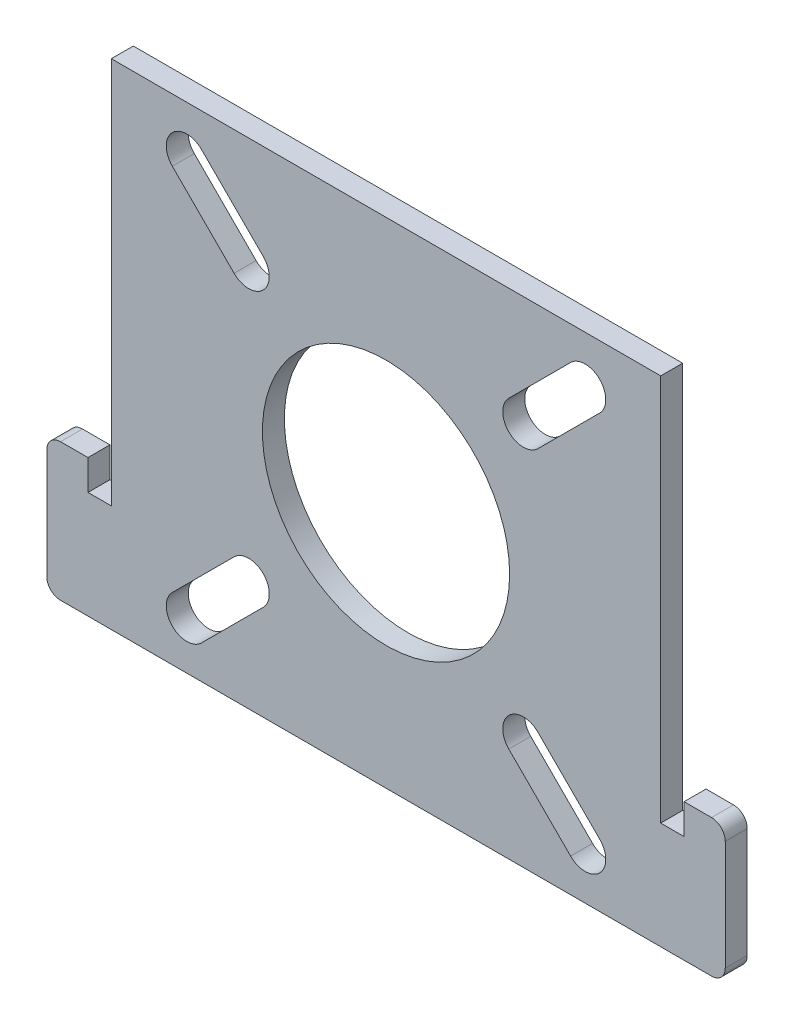
ISO-10303-21;
HEADER;
FILE_DESCRIPTION(('STEP AP214'),'2;1');
FILE_NAME('part.step','',(''),(''),'','','');
FILE_SCHEMA(('AUTOMOTIVE_DESIGN { 1 0 10303 214 1 1 1 1 }'));
ENDSEC;
DATA;
#1=APPLICATION_CONTEXT('core data for automotive mechanical design processes');
#2=APPLICATION_PROTOCOL_DEFINITION('international standard','automotive_design',2000,#1);
#3=PRODUCT_CONTEXT('',#1,'mechanical');
#4=PRODUCT('Part','Part','',(#3));
#5=PRODUCT_RELATED_PRODUCT_CATEGORY('part','',(#4));
#6=PRODUCT_DEFINITION_FORMATION('','',#4);
#7=PRODUCT_DEFINITION_CONTEXT('part definition',#1,'design');
#8=PRODUCT_DEFINITION('design','',#6,#7);
#9=PRODUCT_DEFINITION_SHAPE('','',#8);
#10=(LENGTH_UNIT() NAMED_UNIT(*) SI_UNIT(.MILLI.,.METRE.));
#11=(NAMED_UNIT(*) PLANE_ANGLE_UNIT() SI_UNIT($,.RADIAN.));
#12=(NAMED_UNIT(*) SI_UNIT($,.STERADIAN.) SOLID_ANGLE_UNIT());
#13=UNCERTAINTY_MEASURE_WITH_UNIT(LENGTH_MEASURE(1.E-05),#10,'distance_accuracy_value','');
#14=(GEOMETRIC_REPRESENTATION_CONTEXT(3) GLOBAL_UNCERTAINTY_ASSIGNED_CONTEXT((#13)) GLOBAL_UNIT_ASSIGNED_CONTEXT((#10,
#11,#12)) REPRESENTATION_CONTEXT('',''));
#15=CARTESIAN_POINT('',(0.,0.,0.));
#16=DIRECTION('',(0.,0.,1.));
#17=DIRECTION('',(1.,0.,0.));
#18=AXIS2_PLACEMENT_3D('',#15,#16,#17);
#19=CARTESIAN_POINT('',(-20.,18.,1.6));
#20=DIRECTION('',(1.,0.,0.));
#21=DIRECTION('',(0.,1.,0.));
#22=AXIS2_PLACEMENT_3D('',#19,#20,#21);
#23=PLANE('',#22);
#24=DIRECTION('',(0.,0.,-1.));
#25=VECTOR('',#24,1.);
#26=CARTESIAN_POINT('',(-20.,-10.2,12.6494343746637));
#27=LINE('',#26,#25);
#28=CARTESIAN_POINT('',(-20.,-10.2,1.6));
#29=VERTEX_POINT('',#28);
#30=CARTESIAN_POINT('',(-20.,-10.2,0.));
#31=VERTEX_POINT('',#30);
#32=EDGE_CURVE('E282',#29,#31,#27,.T.);
#33=ORIENTED_EDGE('',*,*,#32,.F.);
#34=DIRECTION('',(0.,-1.,0.));
#35=VECTOR('',#34,1.);
#36=CARTESIAN_POINT('',(-20.,18.,1.6));
#37=LINE('',#36,#35);
#38=CARTESIAN_POINT('',(-20.,18.,1.6));
#39=VERTEX_POINT('',#38);
#40=EDGE_CURVE('E287',#39,#29,#37,.T.);
#41=ORIENTED_EDGE('',*,*,#40,.F.);
#42=DIRECTION('',(0.,0.,-1.));
#43=VECTOR('',#42,1.);
#44=CARTESIAN_POINT('',(-20.,18.,1.6));
#45=LINE('',#44,#43);
#46=CARTESIAN_POINT('',(-20.,18.,0.));
#47=VERTEX_POINT('',#46);
#48=EDGE_CURVE('E344',#39,#47,#45,.T.);
#49=ORIENTED_EDGE('',*,*,#48,.T.);
#50=DIRECTION('',(0.,-1.,0.));
#51=VECTOR('',#50,1.);
#52=CARTESIAN_POINT('',(-20.,18.,0.));
#53=LINE('',#52,#51);
#54=EDGE_CURVE('E386',#47,#31,#53,.T.);
#55=ORIENTED_EDGE('',*,*,#54,.T.);
#56=EDGE_LOOP('',(#33,#41,#49,#55));
#57=FACE_BOUND('',#56,.T.);
#58=ADVANCED_FACE('F34',(#57),#23,.F.);
#59=CARTESIAN_POINT('',(0.,0.,1.6));
#60=DIRECTION('',(0.,0.,1.));
#61=DIRECTION('',(1.,0.,0.));
#62=AXIS2_PLACEMENT_3D('',#59,#60,#61);
#63=PLANE('',#62);
#64=DIRECTION('',(0.707106781186548,-0.707106781186547,0.));
#65=VECTOR('',#64,1.);
#66=CARTESIAN_POINT('',(8.93933982822018,-11.0606601717798,1.6));
#67=LINE('',#66,#65);
#68=CARTESIAN_POINT('',(8.93933982822018,-11.0606601717798,1.6));
#69=VERTEX_POINT('',#68);
#70=CARTESIAN_POINT('',(13.4393398282202,-15.5606601717798,1.6));
#71=VERTEX_POINT('',#70);
#72=EDGE_CURVE('E442',#69,#71,#67,.T.);
#73=ORIENTED_EDGE('',*,*,#72,.F.);
#74=CARTESIAN_POINT('',(10.,-10.,1.6));
#75=DIRECTION('',(0.,0.,1.));
#76=DIRECTION('',(1.,0.,0.));
#77=AXIS2_PLACEMENT_3D('',#74,#75,#76);
#78=CIRCLE('',#77,1.5);
#79=CARTESIAN_POINT('',(11.0606601717798,-8.93933982822018,1.6));
#80=VERTEX_POINT('',#79);
#81=EDGE_CURVE('E440',#80,#69,#78,.T.);
#82=ORIENTED_EDGE('',*,*,#81,.F.);
#83=DIRECTION('',(-0.707106781186549,0.707106781186546,0.));
#84=VECTOR('',#83,1.);
#85=CARTESIAN_POINT('',(11.0606601717798,-8.93933982822018,1.6));
#86=LINE('',#85,#84);
#87=CARTESIAN_POINT('',(15.5606601717798,-13.4393398282202,1.6));
#88=VERTEX_POINT('',#87);
#89=EDGE_CURVE('E448',#88,#80,#86,.T.);
#90=ORIENTED_EDGE('',*,*,#89,.F.);
#91=CARTESIAN_POINT('',(14.5,-14.5,1.6));
#92=DIRECTION('',(0.,0.,1.));
#93=DIRECTION('',(1.,0.,0.));
#94=AXIS2_PLACEMENT_3D('',#91,#92,#93);
#95=CIRCLE('',#94,1.5);
#96=EDGE_CURVE('E445',#71,#88,#95,.T.);
#97=ORIENTED_EDGE('',*,*,#96,.F.);
#98=EDGE_LOOP('',(#73,#82,#90,#97));
#99=FACE_BOUND('',#98,.T.);
#100=DIRECTION('',(0.707106781186548,-0.707106781186547,0.));
#101=VECTOR('',#100,1.);
#102=CARTESIAN_POINT('',(-15.5606601717798,13.4393398282202,1.6));
#103=LINE('',#102,#101);
#104=CARTESIAN_POINT('',(-15.5606601717798,13.4393398282202,1.6));
#105=VERTEX_POINT('',#104);
#106=CARTESIAN_POINT('',(-11.0606601717798,8.93933982822018,1.6));
#107=VERTEX_POINT('',#106);
#108=EDGE_CURVE('E504',#105,#107,#103,.T.);
#109=ORIENTED_EDGE('',*,*,#108,.F.);
#110=CARTESIAN_POINT('',(-14.5,14.5,1.6));
#111=DIRECTION('',(0.,0.,1.));
#112=DIRECTION('',(1.,0.,0.));
#113=AXIS2_PLACEMENT_3D('',#110,#111,#112);
#114=CIRCLE('',#113,1.5);
#115=CARTESIAN_POINT('',(-13.4393398282202,15.5606601717798,1.6));
#116=VERTEX_POINT('',#115);
#117=EDGE_CURVE('E502',#116,#105,#114,.T.);
#118=ORIENTED_EDGE('',*,*,#117,.F.);
#119=DIRECTION('',(-0.707106781186547,0.707106781186548,0.));
#120=VECTOR('',#119,1.);
#121=CARTESIAN_POINT('',(-13.4393398282202,15.5606601717798,1.6));
#122=LINE('',#121,#120);
#123=CARTESIAN_POINT('',(-8.93933982822018,11.0606601717798,1.6));
#124=VERTEX_POINT('',#123);
#125=EDGE_CURVE('E510',#124,#116,#122,.T.);
#126=ORIENTED_EDGE('',*,*,#125,.F.);
#127=CARTESIAN_POINT('',(-10.,10.,1.6));
#128=DIRECTION('',(0.,0.,1.));
#129=DIRECTION('',(1.,0.,0.));
#130=AXIS2_PLACEMENT_3D('',#127,#128,#129);
#131=CIRCLE('',#130,1.5);
#132=EDGE_CURVE('E507',#107,#124,#131,.T.);
#133=ORIENTED_EDGE('',*,*,#132,.F.);
#134=EDGE_LOOP('',(#109,#118,#126,#133));
#135=FACE_BOUND('',#134,.T.);
#136=DIRECTION('',(0.,1.,0.));
#137=VECTOR('',#136,1.);
#138=CARTESIAN_POINT('',(24.7,-18.,1.6));
#139=LINE('',#138,#137);
#140=CARTESIAN_POINT('',(24.7,-17.,1.6));
#141=VERTEX_POINT('',#140);
#142=CARTESIAN_POINT('',(24.7,-9.,1.6));
#143=VERTEX_POINT('',#142);
#144=EDGE_CURVE('E397',#141,#143,#139,.T.);
#145=ORIENTED_EDGE('',*,*,#144,.T.);
#146=CARTESIAN_POINT('',(23.7,-9.,1.6));
#147=DIRECTION('',(0.,0.,1.));
#148=DIRECTION('',(1.,0.,0.));
#149=AXIS2_PLACEMENT_3D('',#146,#147,#148);
#150=CIRCLE('',#149,1.);
#151=CARTESIAN_POINT('',(23.7,-8.,1.6));
#152=VERTEX_POINT('',#151);
#153=EDGE_CURVE('E318',#143,#152,#150,.T.);
#154=ORIENTED_EDGE('',*,*,#153,.T.);
#155=DIRECTION('',(-1.,0.,0.));
#156=VECTOR('',#155,1.);
#157=CARTESIAN_POINT('',(24.7,-8.,1.6));
#158=LINE('',#157,#156);
#159=CARTESIAN_POINT('',(21.7,-8.,1.6));
#160=VERTEX_POINT('',#159);
#161=EDGE_CURVE('E932',#152,#160,#158,.T.);
#162=ORIENTED_EDGE('',*,*,#161,.T.);
#163=DIRECTION('',(0.,-1.,0.));
#164=VECTOR('',#163,1.);
#165=CARTESIAN_POINT('',(21.7,-8.,1.6));
#166=LINE('',#165,#164);
#167=CARTESIAN_POINT('',(21.7,-10.2,1.6));
#168=VERTEX_POINT('',#167);
#169=EDGE_CURVE('E422',#160,#168,#166,.T.);
#170=ORIENTED_EDGE('',*,*,#169,.T.);
#171=DIRECTION('',(-1.,0.,0.));
#172=VECTOR('',#171,1.);
#173=CARTESIAN_POINT('',(21.7,-10.2,1.6));
#174=LINE('',#173,#172);
#175=CARTESIAN_POINT('',(20.,-10.2,1.6));
#176=VERTEX_POINT('',#175);
#177=EDGE_CURVE('E395',#168,#176,#174,.T.);
#178=ORIENTED_EDGE('',*,*,#177,.T.);
#179=DIRECTION('',(0.,1.,0.));
#180=VECTOR('',#179,1.);
#181=CARTESIAN_POINT('',(20.,18.,1.6));
#182=LINE('',#181,#180);
#183=CARTESIAN_POINT('',(20.,18.,1.6));
#184=VERTEX_POINT('',#183);
#185=EDGE_CURVE('E362',#176,#184,#182,.T.);
#186=ORIENTED_EDGE('',*,*,#185,.T.);
#187=DIRECTION('',(-1.,0.,0.));
#188=VECTOR('',#187,1.);
#189=CARTESIAN_POINT('',(-20.,18.,1.6));
#190=LINE('',#189,#188);
#191=EDGE_CURVE('E349',#184,#39,#190,.T.);
#192=ORIENTED_EDGE('',*,*,#191,.T.);
#193=ORIENTED_EDGE('',*,*,#40,.T.);
#194=DIRECTION('',(1.,0.,0.));
#195=VECTOR('',#194,1.);
#196=CARTESIAN_POINT('',(-21.7,-10.2,1.6));
#197=LINE('',#196,#195);
#198=CARTESIAN_POINT('',(-21.7,-10.2,1.6));
#199=VERTEX_POINT('',#198);
#200=EDGE_CURVE('E286',#199,#29,#197,.T.);
#201=ORIENTED_EDGE('',*,*,#200,.F.);
#202=DIRECTION('',(0.,-1.,0.));
#203=VECTOR('',#202,1.);
#204=CARTESIAN_POINT('',(-21.7,-8.,1.6));
#205=LINE('',#204,#203);
#206=CARTESIAN_POINT('',(-21.7,-8.,1.6));
#207=VERTEX_POINT('',#206);
#208=EDGE_CURVE('E264',#207,#199,#205,.T.);
#209=ORIENTED_EDGE('',*,*,#208,.F.);
#210=DIRECTION('',(1.,0.,0.));
#211=VECTOR('',#210,1.);
#212=CARTESIAN_POINT('',(-24.7,-8.,1.6));
#213=LINE('',#212,#211);
#214=CARTESIAN_POINT('',(-23.7,-8.,1.6));
#215=VERTEX_POINT('',#214);
#216=EDGE_CURVE('E260',#215,#207,#213,.T.);
#217=ORIENTED_EDGE('',*,*,#216,.F.);
#218=CARTESIAN_POINT('',(-23.7,-9.,1.6));
#219=DIRECTION('',(0.,0.,1.));
#220=DIRECTION('',(1.,0.,0.));
#221=AXIS2_PLACEMENT_3D('',#218,#219,#220);
#222=CIRCLE('',#221,1.);
#223=CARTESIAN_POINT('',(-24.7,-9.,1.6));
#224=VERTEX_POINT('',#223);
#225=EDGE_CURVE('E49',#215,#224,#222,.T.);
#226=ORIENTED_EDGE('',*,*,#225,.T.);
#227=DIRECTION('',(0.,1.,0.));
#228=VECTOR('',#227,1.);
#229=CARTESIAN_POINT('',(-24.7,-18.,1.6));
#230=LINE('',#229,#228);
#231=CARTESIAN_POINT('',(-24.7,-17.,1.6));
#232=VERTEX_POINT('',#231);
#233=EDGE_CURVE('E272',#232,#224,#230,.T.);
#234=ORIENTED_EDGE('',*,*,#233,.F.);
#235=CARTESIAN_POINT('',(-23.7,-17.,1.6));
#236=DIRECTION('',(0.,0.,1.));
#237=DIRECTION('',(1.,0.,0.));
#238=AXIS2_PLACEMENT_3D('',#235,#236,#237);
#239=CIRCLE('',#238,1.);
#240=CARTESIAN_POINT('',(-23.7,-18.,1.6));
#241=VERTEX_POINT('',#240);
#242=EDGE_CURVE('E314',#232,#241,#239,.T.);
#243=ORIENTED_EDGE('',*,*,#242,.T.);
#244=DIRECTION('',(1.,0.,0.));
#245=VECTOR('',#244,1.);
#246=CARTESIAN_POINT('',(-20.,-18.,1.6));
#247=LINE('',#246,#245);
#248=CARTESIAN_POINT('',(23.7,-18.,1.6));
#249=VERTEX_POINT('',#248);
#250=EDGE_CURVE('E342',#241,#249,#247,.T.);
#251=ORIENTED_EDGE('',*,*,#250,.T.);
#252=CARTESIAN_POINT('',(23.7,-17.,1.6));
#253=DIRECTION('',(0.,0.,1.));
#254=DIRECTION('',(1.,0.,0.));
#255=AXIS2_PLACEMENT_3D('',#252,#253,#254);
#256=CIRCLE('',#255,1.);
#257=EDGE_CURVE('E316',#249,#141,#256,.T.);
#258=ORIENTED_EDGE('',*,*,#257,.T.);
#259=EDGE_LOOP('',(#145,#154,#162,#170,#178,#186,#192,#193,#201,#209,#217,#226,#234,#243,#251,#258));
#260=FACE_BOUND('',#259,.T.);
#261=CARTESIAN_POINT('',(0.,0.,1.6));
#262=DIRECTION('',(0.,0.,1.));
#263=DIRECTION('',(1.,0.,0.));
#264=AXIS2_PLACEMENT_3D('',#261,#262,#263);
#265=CIRCLE('',#264,9.);
#266=CARTESIAN_POINT('',(9.,0.,1.6));
#267=VERTEX_POINT('',#266);
#268=EDGE_CURVE('E361',#267,#267,#265,.T.);
#269=ORIENTED_EDGE('',*,*,#268,.F.);
#270=EDGE_LOOP('',(#269));
#271=FACE_BOUND('',#270,.T.);
#272=DIRECTION('',(0.707106781186548,0.707106781186547,0.));
#273=VECTOR('',#272,1.);
#274=CARTESIAN_POINT('',(11.0606601717798,8.93933982822018,1.6));
#275=LINE('',#274,#273);
#276=CARTESIAN_POINT('',(11.0606601717798,8.93933982822018,1.6));
#277=VERTEX_POINT('',#276);
#278=CARTESIAN_POINT('',(15.5606601717798,13.4393398282202,1.6));
#279=VERTEX_POINT('',#278);
#280=EDGE_CURVE('E473',#277,#279,#275,.T.);
#281=ORIENTED_EDGE('',*,*,#280,.F.);
#282=CARTESIAN_POINT('',(9.99999999999999,10.,1.6));
#283=DIRECTION('',(0.,0.,1.));
#284=DIRECTION('',(1.,0.,0.));
#285=AXIS2_PLACEMENT_3D('',#282,#283,#284);
#286=CIRCLE('',#285,1.5);
#287=CARTESIAN_POINT('',(8.93933982822017,11.0606601717798,1.6));
#288=VERTEX_POINT('',#287);
#289=EDGE_CURVE('E471',#288,#277,#286,.T.);
#290=ORIENTED_EDGE('',*,*,#289,.F.);
#291=DIRECTION('',(-0.707106781186547,-0.707106781186548,0.));
#292=VECTOR('',#291,1.);
#293=CARTESIAN_POINT('',(8.93933982822017,11.0606601717798,1.6));
#294=LINE('',#293,#292);
#295=CARTESIAN_POINT('',(13.4393398282202,15.5606601717798,1.6));
#296=VERTEX_POINT('',#295);
#297=EDGE_CURVE('E479',#296,#288,#294,.T.);
#298=ORIENTED_EDGE('',*,*,#297,.F.);
#299=CARTESIAN_POINT('',(14.5,14.5,1.6));
#300=DIRECTION('',(0.,0.,1.));
#301=DIRECTION('',(1.,0.,0.));
#302=AXIS2_PLACEMENT_3D('',#299,#300,#301);
#303=CIRCLE('',#302,1.5);
#304=EDGE_CURVE('E476',#279,#296,#303,.T.);
#305=ORIENTED_EDGE('',*,*,#304,.F.);
#306=EDGE_LOOP('',(#281,#290,#298,#305));
#307=FACE_BOUND('',#306,.T.);
#308=DIRECTION('',(0.707106781186548,0.707106781186547,0.));
#309=VECTOR('',#308,1.);
#310=CARTESIAN_POINT('',(-13.4393398282202,-15.5606601717798,1.6));
#311=LINE('',#310,#309);
#312=CARTESIAN_POINT('',(-13.4393398282202,-15.5606601717798,1.6));
#313=VERTEX_POINT('',#312);
#314=CARTESIAN_POINT('',(-8.93933982822018,-11.0606601717798,1.6));
#315=VERTEX_POINT('',#314);
#316=EDGE_CURVE('E409',#313,#315,#311,.T.);
#317=ORIENTED_EDGE('',*,*,#316,.F.);
#318=CARTESIAN_POINT('',(-14.5,-14.5,1.6));
#319=DIRECTION('',(0.,0.,1.));
#320=DIRECTION('',(1.,0.,0.));
#321=AXIS2_PLACEMENT_3D('',#318,#319,#320);
#322=CIRCLE('',#321,1.5);
#323=CARTESIAN_POINT('',(-15.5606601717798,-13.4393398282202,1.6));
#324=VERTEX_POINT('',#323);
#325=EDGE_CURVE('E407',#324,#313,#322,.T.);
#326=ORIENTED_EDGE('',*,*,#325,.F.);
#327=DIRECTION('',(-0.707106781186547,-0.707106781186548,0.));
#328=VECTOR('',#327,1.);
#329=CARTESIAN_POINT('',(-15.5606601717798,-13.4393398282202,1.6));
#330=LINE('',#329,#328);
#331=CARTESIAN_POINT('',(-11.0606601717798,-8.93933982822018,1.6));
#332=VERTEX_POINT('',#331);
#333=EDGE_CURVE('E415',#332,#324,#330,.T.);
#334=ORIENTED_EDGE('',*,*,#333,.F.);
#335=CARTESIAN_POINT('',(-10.,-10.,1.6));
#336=DIRECTION('',(0.,0.,1.));
#337=DIRECTION('',(1.,0.,0.));
#338=AXIS2_PLACEMENT_3D('',#335,#336,#337);
#339=CIRCLE('',#338,1.5);
#340=EDGE_CURVE('E412',#315,#332,#339,.T.);
#341=ORIENTED_EDGE('',*,*,#340,.F.);
#342=EDGE_LOOP('',(#317,#326,#334,#341));
#343=FACE_BOUND('',#342,.T.);
#344=ADVANCED_FACE('F374',(#99,#135,#260,#271,#307,#343),#63,.T.);
#345=CARTESIAN_POINT('',(0.,0.,0.));
#346=DIRECTION('',(0.,0.,1.));
#347=DIRECTION('',(1.,0.,0.));
#348=AXIS2_PLACEMENT_3D('',#345,#346,#347);
#349=PLANE('',#348);
#350=CARTESIAN_POINT('',(10.,-10.,0.));
#351=DIRECTION('',(0.,0.,1.));
#352=DIRECTION('',(1.,0.,0.));
#353=AXIS2_PLACEMENT_3D('',#350,#351,#352);
#354=CIRCLE('',#353,1.5);
#355=CARTESIAN_POINT('',(11.0606601717798,-8.93933982822019,0.));
#356=VERTEX_POINT('',#355);
#357=CARTESIAN_POINT('',(8.93933982822018,-11.0606601717798,0.));
#358=VERTEX_POINT('',#357);
#359=EDGE_CURVE('E439',#356,#358,#354,.T.);
#360=ORIENTED_EDGE('',*,*,#359,.T.);
#361=DIRECTION('',(0.707106781186548,-0.707106781186547,0.));
#362=VECTOR('',#361,1.);
#363=CARTESIAN_POINT('',(8.93933982822018,-11.0606601717798,0.));
#364=LINE('',#363,#362);
#365=CARTESIAN_POINT('',(13.4393398282202,-15.5606601717798,0.));
#366=VERTEX_POINT('',#365);
#367=EDGE_CURVE('E453',#358,#366,#364,.T.);
#368=ORIENTED_EDGE('',*,*,#367,.T.);
#369=CARTESIAN_POINT('',(14.5,-14.5,0.));
#370=DIRECTION('',(0.,0.,1.));
#371=DIRECTION('',(1.,0.,0.));
#372=AXIS2_PLACEMENT_3D('',#369,#370,#371);
#373=CIRCLE('',#372,1.5);
#374=CARTESIAN_POINT('',(15.5606601717798,-13.4393398282202,0.));
#375=VERTEX_POINT('',#374);
#376=EDGE_CURVE('E456',#366,#375,#373,.T.);
#377=ORIENTED_EDGE('',*,*,#376,.T.);
#378=DIRECTION('',(-0.707106781186549,0.707106781186546,0.));
#379=VECTOR('',#378,1.);
#380=CARTESIAN_POINT('',(11.0606601717798,-8.93933982822018,0.));
#381=LINE('',#380,#379);
#382=EDGE_CURVE('E443',#375,#356,#381,.T.);
#383=ORIENTED_EDGE('',*,*,#382,.T.);
#384=EDGE_LOOP('',(#360,#368,#377,#383));
#385=FACE_BOUND('',#384,.T.);
#386=CARTESIAN_POINT('',(-14.5,14.5,0.));
#387=DIRECTION('',(0.,0.,1.));
#388=DIRECTION('',(1.,0.,0.));
#389=AXIS2_PLACEMENT_3D('',#386,#387,#388);
#390=CIRCLE('',#389,1.5);
#391=CARTESIAN_POINT('',(-13.4393398282202,15.5606601717798,0.));
#392=VERTEX_POINT('',#391);
#393=CARTESIAN_POINT('',(-15.5606601717798,13.4393398282202,0.));
#394=VERTEX_POINT('',#393);
#395=EDGE_CURVE('E501',#392,#394,#390,.T.);
#396=ORIENTED_EDGE('',*,*,#395,.T.);
#397=DIRECTION('',(0.707106781186548,-0.707106781186547,0.));
#398=VECTOR('',#397,1.);
#399=CARTESIAN_POINT('',(-15.5606601717798,13.4393398282202,0.));
#400=LINE('',#399,#398);
#401=CARTESIAN_POINT('',(-11.0606601717798,8.93933982822018,0.));
#402=VERTEX_POINT('',#401);
#403=EDGE_CURVE('E515',#394,#402,#400,.T.);
#404=ORIENTED_EDGE('',*,*,#403,.T.);
#405=CARTESIAN_POINT('',(-10.,10.,0.));
#406=DIRECTION('',(0.,0.,1.));
#407=DIRECTION('',(1.,0.,0.));
#408=AXIS2_PLACEMENT_3D('',#405,#406,#407);
#409=CIRCLE('',#408,1.5);
#410=CARTESIAN_POINT('',(-8.93933982822018,11.0606601717798,0.));
#411=VERTEX_POINT('',#410);
#412=EDGE_CURVE('E518',#402,#411,#409,.T.);
#413=ORIENTED_EDGE('',*,*,#412,.T.);
#414=DIRECTION('',(-0.707106781186547,0.707106781186548,0.));
#415=VECTOR('',#414,1.);
#416=CARTESIAN_POINT('',(-13.4393398282202,15.5606601717798,0.));
#417=LINE('',#416,#415);
#418=EDGE_CURVE('E505',#411,#392,#417,.T.);
#419=ORIENTED_EDGE('',*,*,#418,.T.);
#420=EDGE_LOOP('',(#396,#404,#413,#419));
#421=FACE_BOUND('',#420,.T.);
#422=DIRECTION('',(-1.,0.,0.));
#423=VECTOR('',#422,1.);
#424=CARTESIAN_POINT('',(24.7,-8.,0.));
#425=LINE('',#424,#423);
#426=CARTESIAN_POINT('',(23.7,-8.,0.));
#427=VERTEX_POINT('',#426);
#428=CARTESIAN_POINT('',(21.7,-8.,0.));
#429=VERTEX_POINT('',#428);
#430=EDGE_CURVE('E936',#427,#429,#425,.T.);
#431=ORIENTED_EDGE('',*,*,#430,.F.);
#432=CARTESIAN_POINT('',(23.7,-9.,0.));
#433=DIRECTION('',(0.,0.,1.));
#434=DIRECTION('',(1.,0.,0.));
#435=AXIS2_PLACEMENT_3D('',#432,#433,#434);
#436=CIRCLE('',#435,1.);
#437=CARTESIAN_POINT('',(24.7,-9.,0.));
#438=VERTEX_POINT('',#437);
#439=EDGE_CURVE('E306',#427,#438,#436,.F.);
#440=ORIENTED_EDGE('',*,*,#439,.T.);
#441=DIRECTION('',(0.,1.,0.));
#442=VECTOR('',#441,1.);
#443=CARTESIAN_POINT('',(24.7,-18.,0.));
#444=LINE('',#443,#442);
#445=CARTESIAN_POINT('',(24.7,-17.,0.));
#446=VERTEX_POINT('',#445);
#447=EDGE_CURVE('E400',#446,#438,#444,.T.);
#448=ORIENTED_EDGE('',*,*,#447,.F.);
#449=CARTESIAN_POINT('',(23.7,-17.,0.));
#450=DIRECTION('',(0.,0.,1.));
#451=DIRECTION('',(1.,0.,0.));
#452=AXIS2_PLACEMENT_3D('',#449,#450,#451);
#453=CIRCLE('',#452,1.);
#454=CARTESIAN_POINT('',(23.7,-18.,0.));
#455=VERTEX_POINT('',#454);
#456=EDGE_CURVE('E304',#446,#455,#453,.F.);
#457=ORIENTED_EDGE('',*,*,#456,.T.);
#458=DIRECTION('',(1.,0.,0.));
#459=VECTOR('',#458,1.);
#460=CARTESIAN_POINT('',(-20.,-18.,0.));
#461=LINE('',#460,#459);
#462=CARTESIAN_POINT('',(-23.7,-18.,0.));
#463=VERTEX_POINT('',#462);
#464=EDGE_CURVE('E332',#463,#455,#461,.T.);
#465=ORIENTED_EDGE('',*,*,#464,.F.);
#466=CARTESIAN_POINT('',(-23.7,-17.,0.));
#467=DIRECTION('',(0.,0.,1.));
#468=DIRECTION('',(1.,0.,0.));
#469=AXIS2_PLACEMENT_3D('',#466,#467,#468);
#470=CIRCLE('',#469,1.);
#471=CARTESIAN_POINT('',(-24.7,-17.,0.));
#472=VERTEX_POINT('',#471);
#473=EDGE_CURVE('E302',#463,#472,#470,.F.);
#474=ORIENTED_EDGE('',*,*,#473,.T.);
#475=DIRECTION('',(0.,1.,0.));
#476=VECTOR('',#475,1.);
#477=CARTESIAN_POINT('',(-24.7,-18.,0.));
#478=LINE('',#477,#476);
#479=CARTESIAN_POINT('',(-24.7,-9.,0.));
#480=VERTEX_POINT('',#479);
#481=EDGE_CURVE('E255',#472,#480,#478,.T.);
#482=ORIENTED_EDGE('',*,*,#481,.T.);
#483=CARTESIAN_POINT('',(-23.7,-9.,0.));
#484=DIRECTION('',(0.,0.,1.));
#485=DIRECTION('',(1.,0.,0.));
#486=AXIS2_PLACEMENT_3D('',#483,#484,#485);
#487=CIRCLE('',#486,1.);
#488=CARTESIAN_POINT('',(-23.7,-8.,0.));
#489=VERTEX_POINT('',#488);
#490=EDGE_CURVE('E252',#480,#489,#487,.F.);
#491=ORIENTED_EDGE('',*,*,#490,.T.);
#492=DIRECTION('',(1.,0.,0.));
#493=VECTOR('',#492,1.);
#494=CARTESIAN_POINT('',(-24.7,-8.,0.));
#495=LINE('',#494,#493);
#496=CARTESIAN_POINT('',(-21.7,-8.,0.));
#497=VERTEX_POINT('',#496);
#498=EDGE_CURVE('E243',#489,#497,#495,.T.);
#499=ORIENTED_EDGE('',*,*,#498,.T.);
#500=DIRECTION('',(0.,-1.,0.));
#501=VECTOR('',#500,1.);
#502=CARTESIAN_POINT('',(-21.7,-8.,0.));
#503=LINE('',#502,#501);
#504=CARTESIAN_POINT('',(-21.7,-10.2,0.));
#505=VERTEX_POINT('',#504);
#506=EDGE_CURVE('E250',#497,#505,#503,.T.);
#507=ORIENTED_EDGE('',*,*,#506,.T.);
#508=DIRECTION('',(1.,0.,0.));
#509=VECTOR('',#508,1.);
#510=CARTESIAN_POINT('',(-21.7,-10.2,0.));
#511=LINE('',#510,#509);
#512=EDGE_CURVE('E270',#505,#31,#511,.T.);
#513=ORIENTED_EDGE('',*,*,#512,.T.);
#514=ORIENTED_EDGE('',*,*,#54,.F.);
#515=DIRECTION('',(-1.,0.,0.));
#516=VECTOR('',#515,1.);
#517=CARTESIAN_POINT('',(-20.,18.,0.));
#518=LINE('',#517,#516);
#519=CARTESIAN_POINT('',(20.,18.,0.));
#520=VERTEX_POINT('',#519);
#521=EDGE_CURVE('E355',#520,#47,#518,.T.);
#522=ORIENTED_EDGE('',*,*,#521,.F.);
#523=DIRECTION('',(0.,1.,0.));
#524=VECTOR('',#523,1.);
#525=CARTESIAN_POINT('',(20.,18.,0.));
#526=LINE('',#525,#524);
#527=CARTESIAN_POINT('',(20.,-10.2,0.));
#528=VERTEX_POINT('',#527);
#529=EDGE_CURVE('E358',#528,#520,#526,.T.);
#530=ORIENTED_EDGE('',*,*,#529,.F.);
#531=DIRECTION('',(-1.,0.,0.));
#532=VECTOR('',#531,1.);
#533=CARTESIAN_POINT('',(21.7,-10.2,0.));
#534=LINE('',#533,#532);
#535=CARTESIAN_POINT('',(21.7,-10.2,0.));
#536=VERTEX_POINT('',#535);
#537=EDGE_CURVE('E365',#536,#528,#534,.T.);
#538=ORIENTED_EDGE('',*,*,#537,.F.);
#539=DIRECTION('',(0.,-1.,0.));
#540=VECTOR('',#539,1.);
#541=CARTESIAN_POINT('',(21.7,-8.,0.));
#542=LINE('',#541,#540);
#543=EDGE_CURVE('E937',#429,#536,#542,.T.);
#544=ORIENTED_EDGE('',*,*,#543,.F.);
#545=EDGE_LOOP('',(#431,#440,#448,#457,#465,#474,#482,#491,#499,#507,#513,#514,#522,#530,#538,#544));
#546=FACE_BOUND('',#545,.T.);
#547=CARTESIAN_POINT('',(0.,0.,0.));
#548=DIRECTION('',(0.,0.,1.));
#549=DIRECTION('',(1.,0.,0.));
#550=AXIS2_PLACEMENT_3D('',#547,#548,#549);
#551=CIRCLE('',#550,9.);
#552=CARTESIAN_POINT('',(9.,0.,0.));
#553=VERTEX_POINT('',#552);
#554=EDGE_CURVE('E369',#553,#553,#551,.T.);
#555=ORIENTED_EDGE('',*,*,#554,.T.);
#556=EDGE_LOOP('',(#555));
#557=FACE_BOUND('',#556,.T.);
#558=CARTESIAN_POINT('',(9.99999999999999,10.,0.));
#559=DIRECTION('',(0.,0.,1.));
#560=DIRECTION('',(1.,0.,0.));
#561=AXIS2_PLACEMENT_3D('',#558,#559,#560);
#562=CIRCLE('',#561,1.5);
#563=CARTESIAN_POINT('',(8.93933982822018,11.0606601717798,0.));
#564=VERTEX_POINT('',#563);
#565=CARTESIAN_POINT('',(11.0606601717798,8.93933982822018,0.));
#566=VERTEX_POINT('',#565);
#567=EDGE_CURVE('E470',#564,#566,#562,.T.);
#568=ORIENTED_EDGE('',*,*,#567,.T.);
#569=DIRECTION('',(0.707106781186548,0.707106781186547,0.));
#570=VECTOR('',#569,1.);
#571=CARTESIAN_POINT('',(11.0606601717798,8.93933982822018,0.));
#572=LINE('',#571,#570);
#573=CARTESIAN_POINT('',(15.5606601717798,13.4393398282202,0.));
#574=VERTEX_POINT('',#573);
#575=EDGE_CURVE('E484',#566,#574,#572,.T.);
#576=ORIENTED_EDGE('',*,*,#575,.T.);
#577=CARTESIAN_POINT('',(14.5,14.5,0.));
#578=DIRECTION('',(0.,0.,1.));
#579=DIRECTION('',(1.,0.,0.));
#580=AXIS2_PLACEMENT_3D('',#577,#578,#579);
#581=CIRCLE('',#580,1.5);
#582=CARTESIAN_POINT('',(13.4393398282202,15.5606601717798,0.));
#583=VERTEX_POINT('',#582);
#584=EDGE_CURVE('E487',#574,#583,#581,.T.);
#585=ORIENTED_EDGE('',*,*,#584,.T.);
#586=DIRECTION('',(-0.707106781186547,-0.707106781186548,0.));
#587=VECTOR('',#586,1.);
#588=CARTESIAN_POINT('',(8.93933982822017,11.0606601717798,0.));
#589=LINE('',#588,#587);
#590=EDGE_CURVE('E474',#583,#564,#589,.T.);
#591=ORIENTED_EDGE('',*,*,#590,.T.);
#592=EDGE_LOOP('',(#568,#576,#585,#591));
#593=FACE_BOUND('',#592,.T.);
#594=CARTESIAN_POINT('',(-14.5,-14.5,0.));
#595=DIRECTION('',(0.,0.,1.));
#596=DIRECTION('',(1.,0.,0.));
#597=AXIS2_PLACEMENT_3D('',#594,#595,#596);
#598=CIRCLE('',#597,1.5);
#599=CARTESIAN_POINT('',(-15.5606601717798,-13.4393398282202,0.));
#600=VERTEX_POINT('',#599);
#601=CARTESIAN_POINT('',(-13.4393398282202,-15.5606601717798,0.));
#602=VERTEX_POINT('',#601);
#603=EDGE_CURVE('E418',#600,#602,#598,.T.);
#604=ORIENTED_EDGE('',*,*,#603,.T.);
#605=DIRECTION('',(0.707106781186548,0.707106781186547,0.));
#606=VECTOR('',#605,1.);
#607=CARTESIAN_POINT('',(-13.4393398282202,-15.5606601717798,0.));
#608=LINE('',#607,#606);
#609=CARTESIAN_POINT('',(-8.93933982822018,-11.0606601717798,0.));
#610=VERTEX_POINT('',#609);
#611=EDGE_CURVE('E421',#602,#610,#608,.T.);
#612=ORIENTED_EDGE('',*,*,#611,.T.);
#613=CARTESIAN_POINT('',(-10.,-10.,0.));
#614=DIRECTION('',(0.,0.,1.));
#615=DIRECTION('',(1.,0.,0.));
#616=AXIS2_PLACEMENT_3D('',#613,#614,#615);
#617=CIRCLE('',#616,1.5);
#618=CARTESIAN_POINT('',(-11.0606601717798,-8.93933982822018,0.));
#619=VERTEX_POINT('',#618);
#620=EDGE_CURVE('E425',#610,#619,#617,.T.);
#621=ORIENTED_EDGE('',*,*,#620,.T.);
#622=DIRECTION('',(-0.707106781186547,-0.707106781186548,0.));
#623=VECTOR('',#622,1.);
#624=CARTESIAN_POINT('',(-15.5606601717798,-13.4393398282202,0.));
#625=LINE('',#624,#623);
#626=EDGE_CURVE('E410',#619,#600,#625,.T.);
#627=ORIENTED_EDGE('',*,*,#626,.T.);
#628=EDGE_LOOP('',(#604,#612,#621,#627));
#629=FACE_BOUND('',#628,.T.);
#630=ADVANCED_FACE('F246',(#385,#421,#546,#557,#593,#629),#349,.F.);
#631=CARTESIAN_POINT('',(20.,18.,1.6));
#632=DIRECTION('',(-1.,0.,0.));
#633=DIRECTION('',(0.,-1.,0.));
#634=AXIS2_PLACEMENT_3D('',#631,#632,#633);
#635=PLANE('',#634);
#636=ORIENTED_EDGE('',*,*,#185,.F.);
#637=DIRECTION('',(0.,0.,-1.));
#638=VECTOR('',#637,1.);
#639=CARTESIAN_POINT('',(20.,-10.2,12.6494343746637));
#640=LINE('',#639,#638);
#641=EDGE_CURVE('E285',#176,#528,#640,.T.);
#642=ORIENTED_EDGE('',*,*,#641,.T.);
#643=ORIENTED_EDGE('',*,*,#529,.T.);
#644=DIRECTION('',(0.,0.,-1.));
#645=VECTOR('',#644,1.);
#646=CARTESIAN_POINT('',(20.,18.,1.6));
#647=LINE('',#646,#645);
#648=EDGE_CURVE('E300',#184,#520,#647,.T.);
#649=ORIENTED_EDGE('',*,*,#648,.F.);
#650=EDGE_LOOP('',(#636,#642,#643,#649));
#651=FACE_BOUND('',#650,.T.);
#652=ADVANCED_FACE('F561',(#651),#635,.F.);
#653=CARTESIAN_POINT('',(-20.,18.,1.6));
#654=DIRECTION('',(0.,-1.,0.));
#655=DIRECTION('',(0.,0.,-1.));
#656=AXIS2_PLACEMENT_3D('',#653,#654,#655);
#657=PLANE('',#656);
#658=ORIENTED_EDGE('',*,*,#521,.T.);
#659=ORIENTED_EDGE('',*,*,#48,.F.);
#660=ORIENTED_EDGE('',*,*,#191,.F.);
#661=ORIENTED_EDGE('',*,*,#648,.T.);
#662=EDGE_LOOP('',(#658,#659,#660,#661));
#663=FACE_BOUND('',#662,.T.);
#664=ADVANCED_FACE('F382',(#663),#657,.F.);
#665=CARTESIAN_POINT('',(-20.,-18.,1.6));
#666=DIRECTION('',(0.,1.,0.));
#667=DIRECTION('',(0.,0.,1.));
#668=AXIS2_PLACEMENT_3D('',#665,#666,#667);
#669=PLANE('',#668);
#670=ORIENTED_EDGE('',*,*,#464,.T.);
#671=DIRECTION('',(0.,0.,-1.));
#672=VECTOR('',#671,1.);
#673=CARTESIAN_POINT('',(23.7,-18.,1.6));
#674=LINE('',#673,#672);
#675=EDGE_CURVE('E323',#455,#249,#674,.F.);
#676=ORIENTED_EDGE('',*,*,#675,.T.);
#677=ORIENTED_EDGE('',*,*,#250,.F.);
#678=DIRECTION('',(0.,0.,-1.));
#679=VECTOR('',#678,1.);
#680=CARTESIAN_POINT('',(-23.7,-18.,0.));
#681=LINE('',#680,#679);
#682=EDGE_CURVE('E320',#241,#463,#681,.T.);
#683=ORIENTED_EDGE('',*,*,#682,.T.);
#684=EDGE_LOOP('',(#670,#676,#677,#683));
#685=FACE_BOUND('',#684,.T.);
#686=ADVANCED_FACE('F339',(#685),#669,.F.);
#687=CARTESIAN_POINT('',(0.,0.,1.6));
#688=DIRECTION('',(0.,0.,-1.));
#689=DIRECTION('',(-1.,0.,0.));
#690=AXIS2_PLACEMENT_3D('',#687,#688,#689);
#691=CYLINDRICAL_SURFACE('',#690,9.);
#692=ORIENTED_EDGE('',*,*,#268,.T.);
#693=EDGE_LOOP('',(#692));
#694=FACE_BOUND('',#693,.T.);
#695=ORIENTED_EDGE('',*,*,#554,.F.);
#696=EDGE_LOOP('',(#695));
#697=FACE_BOUND('',#696,.T.);
#698=ADVANCED_FACE('F538',(#694,#697),#691,.F.);
#699=CARTESIAN_POINT('',(-14.5,14.5,1.6));
#700=DIRECTION('',(0.,0.,-1.));
#701=DIRECTION('',(-1.,0.,0.));
#702=AXIS2_PLACEMENT_3D('',#699,#700,#701);
#703=CYLINDRICAL_SURFACE('',#702,1.5);
#704=ORIENTED_EDGE('',*,*,#395,.F.);
#705=DIRECTION('',(0.,0.,-1.));
#706=VECTOR('',#705,1.);
#707=CARTESIAN_POINT('',(-13.4393398282202,15.5606601717798,1.6));
#708=LINE('',#707,#706);
#709=EDGE_CURVE('E512',#116,#392,#708,.T.);
#710=ORIENTED_EDGE('',*,*,#709,.F.);
#711=ORIENTED_EDGE('',*,*,#117,.T.);
#712=DIRECTION('',(0.,0.,-1.));
#713=VECTOR('',#712,1.);
#714=CARTESIAN_POINT('',(-15.5606601717798,13.4393398282202,1.6));
#715=LINE('',#714,#713);
#716=EDGE_CURVE('E529',#105,#394,#715,.T.);
#717=ORIENTED_EDGE('',*,*,#716,.T.);
#718=EDGE_LOOP('',(#704,#710,#711,#717));
#719=FACE_BOUND('',#718,.T.);
#720=ADVANCED_FACE('F540',(#719),#703,.F.);
#721=CARTESIAN_POINT('',(-15.5606601717798,13.4393398282202,1.6));
#722=DIRECTION('',(0.707106781186547,0.707106781186548,0.));
#723=DIRECTION('',(-0.707106781186548,0.707106781186547,0.));
#724=AXIS2_PLACEMENT_3D('',#721,#722,#723);
#725=PLANE('',#724);
#726=ORIENTED_EDGE('',*,*,#403,.F.);
#727=ORIENTED_EDGE('',*,*,#716,.F.);
#728=ORIENTED_EDGE('',*,*,#108,.T.);
#729=DIRECTION('',(0.,0.,-1.));
#730=VECTOR('',#729,1.);
#731=CARTESIAN_POINT('',(-11.0606601717798,8.93933982822018,1.6));
#732=LINE('',#731,#730);
#733=EDGE_CURVE('E527',#107,#402,#732,.T.);
#734=ORIENTED_EDGE('',*,*,#733,.T.);
#735=EDGE_LOOP('',(#726,#727,#728,#734));
#736=FACE_BOUND('',#735,.T.);
#737=ADVANCED_FACE('F546',(#736),#725,.T.);
#738=CARTESIAN_POINT('',(-10.,10.,1.6));
#739=DIRECTION('',(0.,0.,-1.));
#740=DIRECTION('',(-1.,0.,0.));
#741=AXIS2_PLACEMENT_3D('',#738,#739,#740);
#742=CYLINDRICAL_SURFACE('',#741,1.5);
#743=ORIENTED_EDGE('',*,*,#412,.F.);
#744=ORIENTED_EDGE('',*,*,#733,.F.);
#745=ORIENTED_EDGE('',*,*,#132,.T.);
#746=DIRECTION('',(0.,0.,-1.));
#747=VECTOR('',#746,1.);
#748=CARTESIAN_POINT('',(-8.93933982822018,11.0606601717798,1.6));
#749=LINE('',#748,#747);
#750=EDGE_CURVE('E525',#124,#411,#749,.T.);
#751=ORIENTED_EDGE('',*,*,#750,.T.);
#752=EDGE_LOOP('',(#743,#744,#745,#751));
#753=FACE_BOUND('',#752,.T.);
#754=ADVANCED_FACE('F830',(#753),#742,.F.);
#755=CARTESIAN_POINT('',(-13.4393398282202,15.5606601717798,1.6));
#756=DIRECTION('',(-0.707106781186548,-0.707106781186547,0.));
#757=DIRECTION('',(0.707106781186547,-0.707106781186548,0.));
#758=AXIS2_PLACEMENT_3D('',#755,#756,#757);
#759=PLANE('',#758);
#760=ORIENTED_EDGE('',*,*,#418,.F.);
#761=ORIENTED_EDGE('',*,*,#750,.F.);
#762=ORIENTED_EDGE('',*,*,#125,.T.);
#763=ORIENTED_EDGE('',*,*,#709,.T.);
#764=EDGE_LOOP('',(#760,#761,#762,#763));
#765=FACE_BOUND('',#764,.T.);
#766=ADVANCED_FACE('F820',(#765),#759,.T.);
#767=CARTESIAN_POINT('',(9.99999999999999,10.,1.6));
#768=DIRECTION('',(0.,0.,-1.));
#769=DIRECTION('',(-1.,0.,0.));
#770=AXIS2_PLACEMENT_3D('',#767,#768,#769);
#771=CYLINDRICAL_SURFACE('',#770,1.5);
#772=ORIENTED_EDGE('',*,*,#567,.F.);
#773=DIRECTION('',(0.,0.,-1.));
#774=VECTOR('',#773,1.);
#775=CARTESIAN_POINT('',(8.93933982822017,11.0606601717798,1.6));
#776=LINE('',#775,#774);
#777=EDGE_CURVE('E481',#288,#564,#776,.T.);
#778=ORIENTED_EDGE('',*,*,#777,.F.);
#779=ORIENTED_EDGE('',*,*,#289,.T.);
#780=DIRECTION('',(0.,0.,-1.));
#781=VECTOR('',#780,1.);
#782=CARTESIAN_POINT('',(11.0606601717798,8.93933982822018,1.6));
#783=LINE('',#782,#781);
#784=EDGE_CURVE('E498',#277,#566,#783,.T.);
#785=ORIENTED_EDGE('',*,*,#784,.T.);
#786=EDGE_LOOP('',(#772,#778,#779,#785));
#787=FACE_BOUND('',#786,.T.);
#788=ADVANCED_FACE('F810',(#787),#771,.F.);
#789=CARTESIAN_POINT('',(11.0606601717798,8.93933982822018,1.6));
#790=DIRECTION('',(-0.707106781186547,0.707106781186548,0.));
#791=DIRECTION('',(-0.707106781186548,-0.707106781186547,0.));
#792=AXIS2_PLACEMENT_3D('',#789,#790,#791);
#793=PLANE('',#792);
#794=ORIENTED_EDGE('',*,*,#575,.F.);
#795=ORIENTED_EDGE('',*,*,#784,.F.);
#796=ORIENTED_EDGE('',*,*,#280,.T.);
#797=DIRECTION('',(0.,0.,-1.));
#798=VECTOR('',#797,1.);
#799=CARTESIAN_POINT('',(15.5606601717798,13.4393398282202,1.6));
#800=LINE('',#799,#798);
#801=EDGE_CURVE('E496',#279,#574,#800,.T.);
#802=ORIENTED_EDGE('',*,*,#801,.T.);
#803=EDGE_LOOP('',(#794,#795,#796,#802));
#804=FACE_BOUND('',#803,.T.);
#805=ADVANCED_FACE('F800',(#804),#793,.T.);
#806=CARTESIAN_POINT('',(14.5,14.5,1.6));
#807=DIRECTION('',(0.,0.,-1.));
#808=DIRECTION('',(-1.,0.,0.));
#809=AXIS2_PLACEMENT_3D('',#806,#807,#808);
#810=CYLINDRICAL_SURFACE('',#809,1.5);
#811=ORIENTED_EDGE('',*,*,#584,.F.);
#812=ORIENTED_EDGE('',*,*,#801,.F.);
#813=ORIENTED_EDGE('',*,*,#304,.T.);
#814=DIRECTION('',(0.,0.,-1.));
#815=VECTOR('',#814,1.);
#816=CARTESIAN_POINT('',(13.4393398282202,15.5606601717798,1.6));
#817=LINE('',#816,#815);
#818=EDGE_CURVE('E494',#296,#583,#817,.T.);
#819=ORIENTED_EDGE('',*,*,#818,.T.);
#820=EDGE_LOOP('',(#811,#812,#813,#819));
#821=FACE_BOUND('',#820,.T.);
#822=ADVANCED_FACE('F790',(#821),#810,.F.);
#823=CARTESIAN_POINT('',(8.93933982822017,11.0606601717798,1.6));
#824=DIRECTION('',(0.707106781186548,-0.707106781186547,0.));
#825=DIRECTION('',(0.707106781186547,0.707106781186548,0.));
#826=AXIS2_PLACEMENT_3D('',#823,#824,#825);
#827=PLANE('',#826);
#828=ORIENTED_EDGE('',*,*,#590,.F.);
#829=ORIENTED_EDGE('',*,*,#818,.F.);
#830=ORIENTED_EDGE('',*,*,#297,.T.);
#831=ORIENTED_EDGE('',*,*,#777,.T.);
#832=EDGE_LOOP('',(#828,#829,#830,#831));
#833=FACE_BOUND('',#832,.T.);
#834=ADVANCED_FACE('F780',(#833),#827,.T.);
#835=CARTESIAN_POINT('',(10.,-10.,1.6));
#836=DIRECTION('',(0.,0.,-1.));
#837=DIRECTION('',(-1.,0.,0.));
#838=AXIS2_PLACEMENT_3D('',#835,#836,#837);
#839=CYLINDRICAL_SURFACE('',#838,1.5);
#840=ORIENTED_EDGE('',*,*,#359,.F.);
#841=DIRECTION('',(0.,0.,-1.));
#842=VECTOR('',#841,1.);
#843=CARTESIAN_POINT('',(11.0606601717798,-8.93933982822018,1.6));
#844=LINE('',#843,#842);
#845=EDGE_CURVE('E450',#80,#356,#844,.T.);
#846=ORIENTED_EDGE('',*,*,#845,.F.);
#847=ORIENTED_EDGE('',*,*,#81,.T.);
#848=DIRECTION('',(0.,0.,-1.));
#849=VECTOR('',#848,1.);
#850=CARTESIAN_POINT('',(8.93933982822018,-11.0606601717798,1.6));
#851=LINE('',#850,#849);
#852=EDGE_CURVE('E467',#69,#358,#851,.T.);
#853=ORIENTED_EDGE('',*,*,#852,.T.);
#854=EDGE_LOOP('',(#840,#846,#847,#853));
#855=FACE_BOUND('',#854,.T.);
#856=ADVANCED_FACE('F770',(#855),#839,.F.);
#857=CARTESIAN_POINT('',(8.93933982822018,-11.0606601717798,1.6));
#858=DIRECTION('',(0.707106781186547,0.707106781186548,0.));
#859=DIRECTION('',(-0.707106781186548,0.707106781186547,0.));
#860=AXIS2_PLACEMENT_3D('',#857,#858,#859);
#861=PLANE('',#860);
#862=ORIENTED_EDGE('',*,*,#367,.F.);
#863=ORIENTED_EDGE('',*,*,#852,.F.);
#864=ORIENTED_EDGE('',*,*,#72,.T.);
#865=DIRECTION('',(0.,0.,-1.));
#866=VECTOR('',#865,1.);
#867=CARTESIAN_POINT('',(13.4393398282202,-15.5606601717798,1.6));
#868=LINE('',#867,#866);
#869=EDGE_CURVE('E465',#71,#366,#868,.T.);
#870=ORIENTED_EDGE('',*,*,#869,.T.);
#871=EDGE_LOOP('',(#862,#863,#864,#870));
#872=FACE_BOUND('',#871,.T.);
#873=ADVANCED_FACE('F760',(#872),#861,.T.);
#874=CARTESIAN_POINT('',(14.5,-14.5,1.6));
#875=DIRECTION('',(0.,0.,-1.));
#876=DIRECTION('',(-1.,0.,0.));
#877=AXIS2_PLACEMENT_3D('',#874,#875,#876);
#878=CYLINDRICAL_SURFACE('',#877,1.5);
#879=ORIENTED_EDGE('',*,*,#376,.F.);
#880=ORIENTED_EDGE('',*,*,#869,.F.);
#881=ORIENTED_EDGE('',*,*,#96,.T.);
#882=DIRECTION('',(0.,0.,-1.));
#883=VECTOR('',#882,1.);
#884=CARTESIAN_POINT('',(15.5606601717798,-13.4393398282202,1.6));
#885=LINE('',#884,#883);
#886=EDGE_CURVE('E463',#88,#375,#885,.T.);
#887=ORIENTED_EDGE('',*,*,#886,.T.);
#888=EDGE_LOOP('',(#879,#880,#881,#887));
#889=FACE_BOUND('',#888,.T.);
#890=ADVANCED_FACE('F750',(#889),#878,.F.);
#891=CARTESIAN_POINT('',(11.0606601717798,-8.93933982822018,1.6));
#892=DIRECTION('',(-0.707106781186546,-0.707106781186549,0.));
#893=DIRECTION('',(0.707106781186549,-0.707106781186546,0.));
#894=AXIS2_PLACEMENT_3D('',#891,#892,#893);
#895=PLANE('',#894);
#896=ORIENTED_EDGE('',*,*,#382,.F.);
#897=ORIENTED_EDGE('',*,*,#886,.F.);
#898=ORIENTED_EDGE('',*,*,#89,.T.);
#899=ORIENTED_EDGE('',*,*,#845,.T.);
#900=EDGE_LOOP('',(#896,#897,#898,#899));
#901=FACE_BOUND('',#900,.T.);
#902=ADVANCED_FACE('F740',(#901),#895,.T.);
#903=CARTESIAN_POINT('',(-14.5,-14.5,1.6));
#904=DIRECTION('',(0.,0.,-1.));
#905=DIRECTION('',(-1.,0.,0.));
#906=AXIS2_PLACEMENT_3D('',#903,#904,#905);
#907=CYLINDRICAL_SURFACE('',#906,1.5);
#908=ORIENTED_EDGE('',*,*,#603,.F.);
#909=DIRECTION('',(0.,0.,-1.));
#910=VECTOR('',#909,1.);
#911=CARTESIAN_POINT('',(-15.5606601717798,-13.4393398282202,1.6));
#912=LINE('',#911,#910);
#913=EDGE_CURVE('E417',#324,#600,#912,.T.);
#914=ORIENTED_EDGE('',*,*,#913,.F.);
#915=ORIENTED_EDGE('',*,*,#325,.T.);
#916=DIRECTION('',(0.,0.,-1.));
#917=VECTOR('',#916,1.);
#918=CARTESIAN_POINT('',(-13.4393398282202,-15.5606601717798,1.6));
#919=LINE('',#918,#917);
#920=EDGE_CURVE('E436',#313,#602,#919,.T.);
#921=ORIENTED_EDGE('',*,*,#920,.T.);
#922=EDGE_LOOP('',(#908,#914,#915,#921));
#923=FACE_BOUND('',#922,.T.);
#924=ADVANCED_FACE('F730',(#923),#907,.F.);
#925=CARTESIAN_POINT('',(-13.4393398282202,-15.5606601717798,1.6));
#926=DIRECTION('',(-0.707106781186547,0.707106781186548,0.));
#927=DIRECTION('',(-0.707106781186548,-0.707106781186547,0.));
#928=AXIS2_PLACEMENT_3D('',#925,#926,#927);
#929=PLANE('',#928);
#930=ORIENTED_EDGE('',*,*,#611,.F.);
#931=ORIENTED_EDGE('',*,*,#920,.F.);
#932=ORIENTED_EDGE('',*,*,#316,.T.);
#933=DIRECTION('',(0.,0.,-1.));
#934=VECTOR('',#933,1.);
#935=CARTESIAN_POINT('',(-8.93933982822018,-11.0606601717798,1.6));
#936=LINE('',#935,#934);
#937=EDGE_CURVE('E434',#315,#610,#936,.T.);
#938=ORIENTED_EDGE('',*,*,#937,.T.);
#939=EDGE_LOOP('',(#930,#931,#932,#938));
#940=FACE_BOUND('',#939,.T.);
#941=ADVANCED_FACE('F720',(#940),#929,.T.);
#942=CARTESIAN_POINT('',(-10.,-10.,1.6));
#943=DIRECTION('',(0.,0.,-1.));
#944=DIRECTION('',(-1.,0.,0.));
#945=AXIS2_PLACEMENT_3D('',#942,#943,#944);
#946=CYLINDRICAL_SURFACE('',#945,1.5);
#947=ORIENTED_EDGE('',*,*,#620,.F.);
#948=ORIENTED_EDGE('',*,*,#937,.F.);
#949=ORIENTED_EDGE('',*,*,#340,.T.);
#950=DIRECTION('',(0.,0.,-1.));
#951=VECTOR('',#950,1.);
#952=CARTESIAN_POINT('',(-11.0606601717798,-8.93933982822018,1.6));
#953=LINE('',#952,#951);
#954=EDGE_CURVE('E432',#332,#619,#953,.T.);
#955=ORIENTED_EDGE('',*,*,#954,.T.);
#956=EDGE_LOOP('',(#947,#948,#949,#955));
#957=FACE_BOUND('',#956,.T.);
#958=ADVANCED_FACE('F710',(#957),#946,.F.);
#959=CARTESIAN_POINT('',(-15.5606601717798,-13.4393398282202,1.6));
#960=DIRECTION('',(0.707106781186548,-0.707106781186547,0.));
#961=DIRECTION('',(0.707106781186547,0.707106781186548,0.));
#962=AXIS2_PLACEMENT_3D('',#959,#960,#961);
#963=PLANE('',#962);
#964=ORIENTED_EDGE('',*,*,#626,.F.);
#965=ORIENTED_EDGE('',*,*,#954,.F.);
#966=ORIENTED_EDGE('',*,*,#333,.T.);
#967=ORIENTED_EDGE('',*,*,#913,.T.);
#968=EDGE_LOOP('',(#964,#965,#966,#967));
#969=FACE_BOUND('',#968,.T.);
#970=ADVANCED_FACE('F640',(#969),#963,.T.);
#971=CARTESIAN_POINT('',(24.7,-18.,12.6494343746637));
#972=DIRECTION('',(-1.,0.,0.));
#973=DIRECTION('',(0.,0.,1.));
#974=AXIS2_PLACEMENT_3D('',#971,#972,#973);
#975=PLANE('',#974);
#976=ORIENTED_EDGE('',*,*,#447,.T.);
#977=DIRECTION('',(0.,0.,-1.));
#978=VECTOR('',#977,1.);
#979=CARTESIAN_POINT('',(24.7,-9.,12.6494343746637));
#980=LINE('',#979,#978);
#981=EDGE_CURVE('E311',#438,#143,#980,.F.);
#982=ORIENTED_EDGE('',*,*,#981,.T.);
#983=ORIENTED_EDGE('',*,*,#144,.F.);
#984=DIRECTION('',(0.,0.,-1.));
#985=VECTOR('',#984,1.);
#986=CARTESIAN_POINT('',(24.7,-17.,12.6494343746637));
#987=LINE('',#986,#985);
#988=EDGE_CURVE('E308',#141,#446,#987,.T.);
#989=ORIENTED_EDGE('',*,*,#988,.T.);
#990=EDGE_LOOP('',(#976,#982,#983,#989));
#991=FACE_BOUND('',#990,.T.);
#992=ADVANCED_FACE('F628',(#991),#975,.F.);
#993=CARTESIAN_POINT('',(24.7,-8.,12.6494343746637));
#994=DIRECTION('',(0.,-1.,0.));
#995=DIRECTION('',(1.,0.,0.));
#996=AXIS2_PLACEMENT_3D('',#993,#994,#995);
#997=PLANE('',#996);
#998=ORIENTED_EDGE('',*,*,#161,.F.);
#999=DIRECTION('',(0.,0.,-1.));
#1000=VECTOR('',#999,1.);
#1001=CARTESIAN_POINT('',(23.7,-8.,12.6494343746637));
#1002=LINE('',#1001,#1000);
#1003=EDGE_CURVE('E297',#152,#427,#1002,.T.);
#1004=ORIENTED_EDGE('',*,*,#1003,.T.);
#1005=ORIENTED_EDGE('',*,*,#430,.T.);
#1006=DIRECTION('',(0.,0.,-1.));
#1007=VECTOR('',#1006,1.);
#1008=CARTESIAN_POINT('',(21.7,-8.,12.6494343746637));
#1009=LINE('',#1008,#1007);
#1010=EDGE_CURVE('E929',#160,#429,#1009,.T.);
#1011=ORIENTED_EDGE('',*,*,#1010,.F.);
#1012=EDGE_LOOP('',(#998,#1004,#1005,#1011));
#1013=FACE_BOUND('',#1012,.T.);
#1014=ADVANCED_FACE('F622',(#1013),#997,.F.);
#1015=CARTESIAN_POINT('',(21.7,-8.,12.6494343746637));
#1016=DIRECTION('',(1.,0.,0.));
#1017=DIRECTION('',(0.,0.,-1.));
#1018=AXIS2_PLACEMENT_3D('',#1015,#1016,#1017);
#1019=PLANE('',#1018);
#1020=ORIENTED_EDGE('',*,*,#169,.F.);
#1021=ORIENTED_EDGE('',*,*,#1010,.T.);
#1022=ORIENTED_EDGE('',*,*,#543,.T.);
#1023=DIRECTION('',(0.,0.,-1.));
#1024=VECTOR('',#1023,1.);
#1025=CARTESIAN_POINT('',(21.7,-10.2,12.6494343746637));
#1026=LINE('',#1025,#1024);
#1027=EDGE_CURVE('E405',#168,#536,#1026,.T.);
#1028=ORIENTED_EDGE('',*,*,#1027,.F.);
#1029=EDGE_LOOP('',(#1020,#1021,#1022,#1028));
#1030=FACE_BOUND('',#1029,.T.);
#1031=ADVANCED_FACE('F627',(#1030),#1019,.F.);
#1032=CARTESIAN_POINT('',(21.7,-10.2,12.6494343746637));
#1033=DIRECTION('',(0.,-1.,0.));
#1034=DIRECTION('',(0.,0.,-1.));
#1035=AXIS2_PLACEMENT_3D('',#1032,#1033,#1034);
#1036=PLANE('',#1035);
#1037=ORIENTED_EDGE('',*,*,#177,.F.);
#1038=ORIENTED_EDGE('',*,*,#1027,.T.);
#1039=ORIENTED_EDGE('',*,*,#537,.T.);
#1040=ORIENTED_EDGE('',*,*,#641,.F.);
#1041=EDGE_LOOP('',(#1037,#1038,#1039,#1040));
#1042=FACE_BOUND('',#1041,.T.);
#1043=ADVANCED_FACE('F615',(#1042),#1036,.F.);
#1044=CARTESIAN_POINT('',(-24.7,-18.,12.6494343746637));
#1045=DIRECTION('',(-1.,0.,0.));
#1046=DIRECTION('',(0.,0.,1.));
#1047=AXIS2_PLACEMENT_3D('',#1044,#1045,#1046);
#1048=PLANE('',#1047);
#1049=ORIENTED_EDGE('',*,*,#481,.F.);
#1050=DIRECTION('',(0.,0.,-1.));
#1051=VECTOR('',#1050,1.);
#1052=CARTESIAN_POINT('',(-24.7,-17.,1.6));
#1053=LINE('',#1052,#1051);
#1054=EDGE_CURVE('E42',#472,#232,#1053,.F.);
#1055=ORIENTED_EDGE('',*,*,#1054,.T.);
#1056=ORIENTED_EDGE('',*,*,#233,.T.);
#1057=DIRECTION('',(0.,0.,-1.));
#1058=VECTOR('',#1057,1.);
#1059=CARTESIAN_POINT('',(-24.7,-9.,12.6494343746637));
#1060=LINE('',#1059,#1058);
#1061=EDGE_CURVE('E325',#224,#480,#1060,.T.);
#1062=ORIENTED_EDGE('',*,*,#1061,.T.);
#1063=EDGE_LOOP('',(#1049,#1055,#1056,#1062));
#1064=FACE_BOUND('',#1063,.T.);
#1065=ADVANCED_FACE('F328',(#1064),#1048,.T.);
#1066=CARTESIAN_POINT('',(-24.7,-8.,12.6494343746637));
#1067=DIRECTION('',(0.,1.,0.));
#1068=DIRECTION('',(-1.,0.,0.));
#1069=AXIS2_PLACEMENT_3D('',#1066,#1067,#1068);
#1070=PLANE('',#1069);
#1071=ORIENTED_EDGE('',*,*,#498,.F.);
#1072=DIRECTION('',(0.,0.,-1.));
#1073=VECTOR('',#1072,1.);
#1074=CARTESIAN_POINT('',(-23.7,-8.,12.6494343746637));
#1075=LINE('',#1074,#1073);
#1076=EDGE_CURVE('E11',#489,#215,#1075,.F.);
#1077=ORIENTED_EDGE('',*,*,#1076,.T.);
#1078=ORIENTED_EDGE('',*,*,#216,.T.);
#1079=DIRECTION('',(0.,0.,-1.));
#1080=VECTOR('',#1079,1.);
#1081=CARTESIAN_POINT('',(-21.7,-8.,12.6494343746637));
#1082=LINE('',#1081,#1080);
#1083=EDGE_CURVE('E258',#207,#497,#1082,.T.);
#1084=ORIENTED_EDGE('',*,*,#1083,.T.);
#1085=EDGE_LOOP('',(#1071,#1077,#1078,#1084));
#1086=FACE_BOUND('',#1085,.T.);
#1087=ADVANCED_FACE('F259',(#1086),#1070,.T.);
#1088=CARTESIAN_POINT('',(-21.7,-8.,12.6494343746637));
#1089=DIRECTION('',(1.,0.,0.));
#1090=DIRECTION('',(0.,0.,-1.));
#1091=AXIS2_PLACEMENT_3D('',#1088,#1089,#1090);
#1092=PLANE('',#1091);
#1093=ORIENTED_EDGE('',*,*,#1083,.F.);
#1094=ORIENTED_EDGE('',*,*,#208,.T.);
#1095=DIRECTION('',(0.,0.,-1.));
#1096=VECTOR('',#1095,1.);
#1097=CARTESIAN_POINT('',(-21.7,-10.2,12.6494343746637));
#1098=LINE('',#1097,#1096);
#1099=EDGE_CURVE('E268',#199,#505,#1098,.T.);
#1100=ORIENTED_EDGE('',*,*,#1099,.T.);
#1101=ORIENTED_EDGE('',*,*,#506,.F.);
#1102=EDGE_LOOP('',(#1093,#1094,#1100,#1101));
#1103=FACE_BOUND('',#1102,.T.);
#1104=ADVANCED_FACE('F266',(#1103),#1092,.T.);
#1105=CARTESIAN_POINT('',(-21.7,-10.2,12.6494343746637));
#1106=DIRECTION('',(0.,1.,0.));
#1107=DIRECTION('',(0.,0.,1.));
#1108=AXIS2_PLACEMENT_3D('',#1105,#1106,#1107);
#1109=PLANE('',#1108);
#1110=ORIENTED_EDGE('',*,*,#1099,.F.);
#1111=ORIENTED_EDGE('',*,*,#200,.T.);
#1112=ORIENTED_EDGE('',*,*,#32,.T.);
#1113=ORIENTED_EDGE('',*,*,#512,.F.);
#1114=EDGE_LOOP('',(#1110,#1111,#1112,#1113));
#1115=FACE_BOUND('',#1114,.T.);
#1116=ADVANCED_FACE('F388',(#1115),#1109,.T.);
#1117=CARTESIAN_POINT('',(23.7,-9.,12.6494343746637));
#1118=DIRECTION('',(0.,0.,-1.));
#1119=DIRECTION('',(-1.,0.,0.));
#1120=AXIS2_PLACEMENT_3D('',#1117,#1118,#1119);
#1121=CYLINDRICAL_SURFACE('',#1120,1.);
#1122=ORIENTED_EDGE('',*,*,#153,.F.);
#1123=ORIENTED_EDGE('',*,*,#981,.F.);
#1124=ORIENTED_EDGE('',*,*,#439,.F.);
#1125=ORIENTED_EDGE('',*,*,#1003,.F.);
#1126=EDGE_LOOP('',(#1122,#1123,#1124,#1125));
#1127=FACE_BOUND('',#1126,.T.);
#1128=ADVANCED_FACE('F565',(#1127),#1121,.T.);
#1129=CARTESIAN_POINT('',(23.7,-17.,12.6494343746637));
#1130=DIRECTION('',(0.,0.,-1.));
#1131=DIRECTION('',(-1.,0.,0.));
#1132=AXIS2_PLACEMENT_3D('',#1129,#1130,#1131);
#1133=CYLINDRICAL_SURFACE('',#1132,1.);
#1134=ORIENTED_EDGE('',*,*,#257,.F.);
#1135=ORIENTED_EDGE('',*,*,#675,.F.);
#1136=ORIENTED_EDGE('',*,*,#456,.F.);
#1137=ORIENTED_EDGE('',*,*,#988,.F.);
#1138=EDGE_LOOP('',(#1134,#1135,#1136,#1137));
#1139=FACE_BOUND('',#1138,.T.);
#1140=ADVANCED_FACE('F568',(#1139),#1133,.T.);
#1141=CARTESIAN_POINT('',(-23.7,-17.,1.6));
#1142=DIRECTION('',(0.,0.,1.));
#1143=DIRECTION('',(1.,0.,0.));
#1144=AXIS2_PLACEMENT_3D('',#1141,#1142,#1143);
#1145=CYLINDRICAL_SURFACE('',#1144,1.);
#1146=ORIENTED_EDGE('',*,*,#242,.F.);
#1147=ORIENTED_EDGE('',*,*,#1054,.F.);
#1148=ORIENTED_EDGE('',*,*,#473,.F.);
#1149=ORIENTED_EDGE('',*,*,#682,.F.);
#1150=EDGE_LOOP('',(#1146,#1147,#1148,#1149));
#1151=FACE_BOUND('',#1150,.T.);
#1152=ADVANCED_FACE('F336',(#1151),#1145,.T.);
#1153=CARTESIAN_POINT('',(-23.7,-9.,12.6494343746637));
#1154=DIRECTION('',(0.,0.,-1.));
#1155=DIRECTION('',(-1.,0.,0.));
#1156=AXIS2_PLACEMENT_3D('',#1153,#1154,#1155);
#1157=CYLINDRICAL_SURFACE('',#1156,1.);
#1158=ORIENTED_EDGE('',*,*,#225,.F.);
#1159=ORIENTED_EDGE('',*,*,#1076,.F.);
#1160=ORIENTED_EDGE('',*,*,#490,.F.);
#1161=ORIENTED_EDGE('',*,*,#1061,.F.);
#1162=EDGE_LOOP('',(#1158,#1159,#1160,#1161));
#1163=FACE_BOUND('',#1162,.T.);
#1164=ADVANCED_FACE('F36',(#1163),#1157,.T.);
#1165=CLOSED_SHELL('',(#58,#344,#630,#652,#664,#686,#698,#720,#737,#754,#766,#788,#805,#822,
#834,#856,#873,#890,#902,#924,#941,#958,#970,#992,#1014,#1031,#1043,#1065,#1087,#1104,#1116,
#1128,#1140,#1152,#1164));
#1166=MANIFOLD_SOLID_BREP('B2',#1165);
#1167=ADVANCED_BREP_SHAPE_REPRESENTATION('',(#18,#1166),#14);
#1168=SHAPE_DEFINITION_REPRESENTATION(#9,#1167);
ENDSEC;
END-ISO-10303-21;
